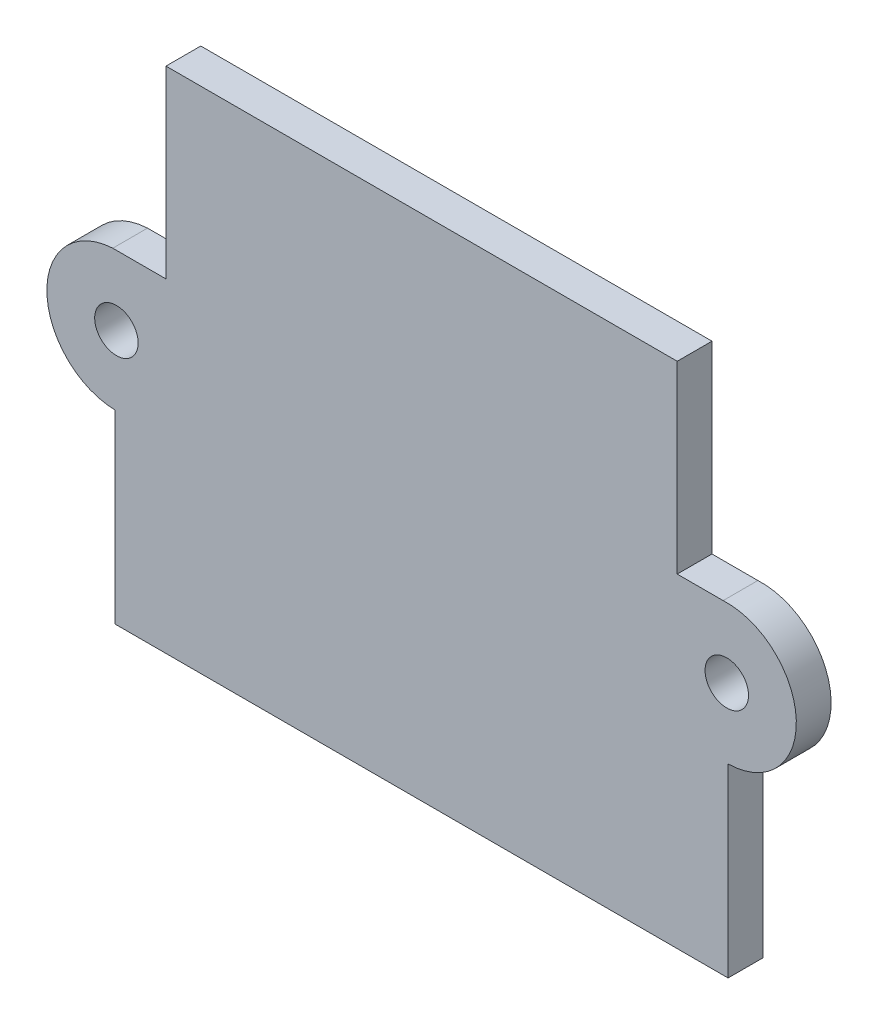
ISO-10303-21;
HEADER;
FILE_DESCRIPTION(('STEP AP214'),'2;1');
FILE_NAME('part.step','',(''),(''),'','','');
FILE_SCHEMA(('AUTOMOTIVE_DESIGN { 1 0 10303 214 1 1 1 1 }'));
ENDSEC;
DATA;
#1=APPLICATION_CONTEXT('core data for automotive mechanical design processes');
#2=APPLICATION_PROTOCOL_DEFINITION('international standard','automotive_design',2000,#1);
#3=PRODUCT_CONTEXT('',#1,'mechanical');
#4=PRODUCT('Part','Part','',(#3));
#5=PRODUCT_RELATED_PRODUCT_CATEGORY('part','',(#4));
#6=PRODUCT_DEFINITION_FORMATION('','',#4);
#7=PRODUCT_DEFINITION_CONTEXT('part definition',#1,'design');
#8=PRODUCT_DEFINITION('design','',#6,#7);
#9=PRODUCT_DEFINITION_SHAPE('','',#8);
#10=(LENGTH_UNIT() NAMED_UNIT(*) SI_UNIT(.MILLI.,.METRE.));
#11=(NAMED_UNIT(*) PLANE_ANGLE_UNIT() SI_UNIT($,.RADIAN.));
#12=(NAMED_UNIT(*) SI_UNIT($,.STERADIAN.) SOLID_ANGLE_UNIT());
#13=UNCERTAINTY_MEASURE_WITH_UNIT(LENGTH_MEASURE(1.E-05),#10,'distance_accuracy_value','');
#14=(GEOMETRIC_REPRESENTATION_CONTEXT(3) GLOBAL_UNCERTAINTY_ASSIGNED_CONTEXT((#13)) GLOBAL_UNIT_ASSIGNED_CONTEXT((#10,
#11,#12)) REPRESENTATION_CONTEXT('',''));
#15=CARTESIAN_POINT('',(0.,0.,0.));
#16=DIRECTION('',(0.,0.,1.));
#17=DIRECTION('',(1.,0.,0.));
#18=AXIS2_PLACEMENT_3D('',#15,#16,#17);
#19=CARTESIAN_POINT('',(8.9154,0.0165573963988308,1.016));
#20=DIRECTION('',(0.,0.,1.));
#21=DIRECTION('',(1.,0.,0.));
#22=AXIS2_PLACEMENT_3D('',#19,#20,#21);
#23=PLANE('',#22);
#24=CARTESIAN_POINT('',(-8.9154,0.0165573963988286,1.016));
#25=DIRECTION('',(0.,0.,1.));
#26=DIRECTION('',(1.,0.,0.));
#27=AXIS2_PLACEMENT_3D('',#24,#25,#26);
#28=CIRCLE('',#27,0.635000005703479);
#29=CARTESIAN_POINT('',(-8.28039999429652,0.0165573963988286,1.016));
#30=VERTEX_POINT('',#29);
#31=EDGE_CURVE('E214',#30,#30,#28,.T.);
#32=ORIENTED_EDGE('',*,*,#31,.F.);
#33=EDGE_LOOP('',(#32));
#34=FACE_BOUND('',#33,.T.);
#35=DIRECTION('',(1.,0.,0.));
#36=VECTOR('',#35,1.);
#37=CARTESIAN_POINT('',(-7.4676,7.43055011809355,1.016));
#38=LINE('',#37,#36);
#39=CARTESIAN_POINT('',(-7.4676,7.43055011809355,1.016));
#40=VERTEX_POINT('',#39);
#41=CARTESIAN_POINT('',(7.4676,7.43055011809355,1.016));
#42=VERTEX_POINT('',#41);
#43=EDGE_CURVE('E234',#40,#42,#38,.T.);
#44=ORIENTED_EDGE('',*,*,#43,.F.);
#45=DIRECTION('',(0.,-1.,0.));
#46=VECTOR('',#45,1.);
#47=CARTESIAN_POINT('',(-7.4676,7.43055011809355,1.016));
#48=LINE('',#47,#46);
#49=CARTESIAN_POINT('',(-7.4676,2.04575011809355,1.016));
#50=VERTEX_POINT('',#49);
#51=EDGE_CURVE('E188',#40,#50,#48,.T.);
#52=ORIENTED_EDGE('',*,*,#51,.T.);
#53=DIRECTION('',(-1.,0.,0.));
#54=VECTOR('',#53,1.);
#55=CARTESIAN_POINT('',(-7.4676,2.04575011809355,1.016));
#56=LINE('',#55,#54);
#57=CARTESIAN_POINT('',(-9.02217498874351,2.04575011809355,1.016));
#58=VERTEX_POINT('',#57);
#59=EDGE_CURVE('E181',#50,#58,#56,.T.);
#60=ORIENTED_EDGE('',*,*,#59,.T.);
#61=CARTESIAN_POINT('',(-8.9154,0.0165573963988286,1.016));
#62=DIRECTION('',(0.,0.,1.));
#63=DIRECTION('',(1.,0.,0.));
#64=AXIS2_PLACEMENT_3D('',#61,#62,#63);
#65=CIRCLE('',#64,2.032);
#66=CARTESIAN_POINT('',(-8.9535,-2.01508538470222,1.016));
#67=VERTEX_POINT('',#66);
#68=EDGE_CURVE('E186',#58,#67,#65,.T.);
#69=ORIENTED_EDGE('',*,*,#68,.T.);
#70=DIRECTION('',(0.,-1.,0.));
#71=VECTOR('',#70,1.);
#72=CARTESIAN_POINT('',(-8.9535,-2.01508538470222,1.016));
#73=LINE('',#72,#71);
#74=CARTESIAN_POINT('',(-8.9535,-7.43055011809355,1.016));
#75=VERTEX_POINT('',#74);
#76=EDGE_CURVE('E203',#67,#75,#73,.T.);
#77=ORIENTED_EDGE('',*,*,#76,.T.);
#78=DIRECTION('',(1.,0.,0.));
#79=VECTOR('',#78,1.);
#80=CARTESIAN_POINT('',(-8.9535,-7.43055011809355,1.016));
#81=LINE('',#80,#79);
#82=CARTESIAN_POINT('',(8.9535,-7.43055011809354,1.016));
#83=VERTEX_POINT('',#82);
#84=EDGE_CURVE('E205',#75,#83,#81,.T.);
#85=ORIENTED_EDGE('',*,*,#84,.T.);
#86=DIRECTION('',(0.,-1.,0.));
#87=VECTOR('',#86,1.);
#88=CARTESIAN_POINT('',(8.9535,-2.01508538470222,1.016));
#89=LINE('',#88,#87);
#90=CARTESIAN_POINT('',(8.9535,-2.01508538470222,1.016));
#91=VERTEX_POINT('',#90);
#92=EDGE_CURVE('E261',#91,#83,#89,.T.);
#93=ORIENTED_EDGE('',*,*,#92,.F.);
#94=CARTESIAN_POINT('',(8.9154,0.0165573963988308,1.016));
#95=DIRECTION('',(0.,0.,1.));
#96=DIRECTION('',(1.,0.,0.));
#97=AXIS2_PLACEMENT_3D('',#94,#95,#96);
#98=CIRCLE('',#97,2.032);
#99=CARTESIAN_POINT('',(8.80862501125642,2.04575011809355,1.016));
#100=VERTEX_POINT('',#99);
#101=EDGE_CURVE('E268',#91,#100,#98,.T.);
#102=ORIENTED_EDGE('',*,*,#101,.T.);
#103=DIRECTION('',(1.,0.,0.));
#104=VECTOR('',#103,1.);
#105=CARTESIAN_POINT('',(7.4676,2.04575011809355,1.016));
#106=LINE('',#105,#104);
#107=CARTESIAN_POINT('',(7.4676,2.04575011809355,1.016));
#108=VERTEX_POINT('',#107);
#109=EDGE_CURVE('E270',#108,#100,#106,.T.);
#110=ORIENTED_EDGE('',*,*,#109,.F.);
#111=DIRECTION('',(0.,-1.,0.));
#112=VECTOR('',#111,1.);
#113=CARTESIAN_POINT('',(7.4676,7.43055011809355,1.016));
#114=LINE('',#113,#112);
#115=EDGE_CURVE('E275',#42,#108,#114,.T.);
#116=ORIENTED_EDGE('',*,*,#115,.F.);
#117=EDGE_LOOP('',(#44,#52,#60,#69,#77,#85,#93,#102,#110,#116));
#118=FACE_BOUND('',#117,.T.);
#119=CARTESIAN_POINT('',(8.9154,0.0165573963988308,1.016));
#120=DIRECTION('',(0.,0.,1.));
#121=DIRECTION('',(1.,0.,0.));
#122=AXIS2_PLACEMENT_3D('',#119,#120,#121);
#123=CIRCLE('',#122,0.635000005703479);
#124=CARTESIAN_POINT('',(9.55040000570348,0.0165573963988308,1.016));
#125=VERTEX_POINT('',#124);
#126=EDGE_CURVE('E281',#125,#125,#123,.T.);
#127=ORIENTED_EDGE('',*,*,#126,.F.);
#128=EDGE_LOOP('',(#127));
#129=FACE_BOUND('',#128,.T.);
#130=ADVANCED_FACE('F99',(#34,#118,#129),#23,.T.);
#131=CARTESIAN_POINT('',(8.9154,0.0165573963988308,0.));
#132=DIRECTION('',(0.,0.,1.));
#133=DIRECTION('',(1.,0.,0.));
#134=AXIS2_PLACEMENT_3D('',#131,#132,#133);
#135=PLANE('',#134);
#136=CARTESIAN_POINT('',(-8.9154,0.0165573963988286,0.));
#137=DIRECTION('',(0.,0.,1.));
#138=DIRECTION('',(1.,0.,0.));
#139=AXIS2_PLACEMENT_3D('',#136,#137,#138);
#140=CIRCLE('',#139,0.635000005703479);
#141=CARTESIAN_POINT('',(-8.28039999429652,0.0165573963988286,0.));
#142=VERTEX_POINT('',#141);
#143=EDGE_CURVE('E278',#142,#142,#140,.T.);
#144=ORIENTED_EDGE('',*,*,#143,.T.);
#145=EDGE_LOOP('',(#144));
#146=FACE_BOUND('',#145,.T.);
#147=DIRECTION('',(1.,0.,0.));
#148=VECTOR('',#147,1.);
#149=CARTESIAN_POINT('',(-7.4676,7.43055011809355,0.));
#150=LINE('',#149,#148);
#151=CARTESIAN_POINT('',(-7.4676,7.43055011809355,0.));
#152=VERTEX_POINT('',#151);
#153=CARTESIAN_POINT('',(7.4676,7.43055011809355,0.));
#154=VERTEX_POINT('',#153);
#155=EDGE_CURVE('E210',#152,#154,#150,.T.);
#156=ORIENTED_EDGE('',*,*,#155,.T.);
#157=DIRECTION('',(0.,-1.,0.));
#158=VECTOR('',#157,1.);
#159=CARTESIAN_POINT('',(7.4676,7.43055011809355,0.));
#160=LINE('',#159,#158);
#161=CARTESIAN_POINT('',(7.4676,2.04575011809355,0.));
#162=VERTEX_POINT('',#161);
#163=EDGE_CURVE('E213',#154,#162,#160,.T.);
#164=ORIENTED_EDGE('',*,*,#163,.T.);
#165=DIRECTION('',(1.,0.,0.));
#166=VECTOR('',#165,1.);
#167=CARTESIAN_POINT('',(7.4676,2.04575011809355,0.));
#168=LINE('',#167,#166);
#169=CARTESIAN_POINT('',(8.80862501125642,2.04575011809355,0.));
#170=VERTEX_POINT('',#169);
#171=EDGE_CURVE('E217',#162,#170,#168,.T.);
#172=ORIENTED_EDGE('',*,*,#171,.T.);
#173=CARTESIAN_POINT('',(8.9154,0.0165573963988308,0.));
#174=DIRECTION('',(0.,0.,1.));
#175=DIRECTION('',(1.,0.,0.));
#176=AXIS2_PLACEMENT_3D('',#173,#174,#175);
#177=CIRCLE('',#176,2.032);
#178=CARTESIAN_POINT('',(8.9535,-2.01508538470222,0.));
#179=VERTEX_POINT('',#178);
#180=EDGE_CURVE('E220',#179,#170,#177,.T.);
#181=ORIENTED_EDGE('',*,*,#180,.F.);
#182=DIRECTION('',(0.,-1.,0.));
#183=VECTOR('',#182,1.);
#184=CARTESIAN_POINT('',(8.9535,-2.01508538470222,0.));
#185=LINE('',#184,#183);
#186=CARTESIAN_POINT('',(8.9535,-7.43055011809354,0.));
#187=VERTEX_POINT('',#186);
#188=EDGE_CURVE('E223',#179,#187,#185,.T.);
#189=ORIENTED_EDGE('',*,*,#188,.T.);
#190=DIRECTION('',(1.,0.,0.));
#191=VECTOR('',#190,1.);
#192=CARTESIAN_POINT('',(-8.9535,-7.43055011809355,0.));
#193=LINE('',#192,#191);
#194=CARTESIAN_POINT('',(-8.9535,-7.43055011809355,0.));
#195=VERTEX_POINT('',#194);
#196=EDGE_CURVE('E226',#195,#187,#193,.T.);
#197=ORIENTED_EDGE('',*,*,#196,.F.);
#198=DIRECTION('',(0.,-1.,0.));
#199=VECTOR('',#198,1.);
#200=CARTESIAN_POINT('',(-8.9535,-2.01508538470222,0.));
#201=LINE('',#200,#199);
#202=CARTESIAN_POINT('',(-8.9535,-2.01508538470222,0.));
#203=VERTEX_POINT('',#202);
#204=EDGE_CURVE('E229',#203,#195,#201,.T.);
#205=ORIENTED_EDGE('',*,*,#204,.F.);
#206=CARTESIAN_POINT('',(-8.9154,0.0165573963988286,0.));
#207=DIRECTION('',(0.,0.,1.));
#208=DIRECTION('',(1.,0.,0.));
#209=AXIS2_PLACEMENT_3D('',#206,#207,#208);
#210=CIRCLE('',#209,2.032);
#211=CARTESIAN_POINT('',(-9.02217498874351,2.04575011809355,0.));
#212=VERTEX_POINT('',#211);
#213=EDGE_CURVE('E231',#212,#203,#210,.T.);
#214=ORIENTED_EDGE('',*,*,#213,.F.);
#215=DIRECTION('',(-1.,0.,0.));
#216=VECTOR('',#215,1.);
#217=CARTESIAN_POINT('',(-7.4676,2.04575011809355,0.));
#218=LINE('',#217,#216);
#219=CARTESIAN_POINT('',(-7.4676,2.04575011809355,0.));
#220=VERTEX_POINT('',#219);
#221=EDGE_CURVE('E195',#220,#212,#218,.T.);
#222=ORIENTED_EDGE('',*,*,#221,.F.);
#223=DIRECTION('',(0.,-1.,0.));
#224=VECTOR('',#223,1.);
#225=CARTESIAN_POINT('',(-7.4676,7.43055011809355,0.));
#226=LINE('',#225,#224);
#227=EDGE_CURVE('E151',#152,#220,#226,.T.);
#228=ORIENTED_EDGE('',*,*,#227,.F.);
#229=EDGE_LOOP('',(#156,#164,#172,#181,#189,#197,#205,#214,#222,#228));
#230=FACE_BOUND('',#229,.T.);
#231=CARTESIAN_POINT('',(8.9154,0.0165573963988308,0.));
#232=DIRECTION('',(0.,0.,1.));
#233=DIRECTION('',(1.,0.,0.));
#234=AXIS2_PLACEMENT_3D('',#231,#232,#233);
#235=CIRCLE('',#234,0.635000005703479);
#236=CARTESIAN_POINT('',(9.55040000570348,0.0165573963988308,0.));
#237=VERTEX_POINT('',#236);
#238=EDGE_CURVE('E284',#237,#237,#235,.T.);
#239=ORIENTED_EDGE('',*,*,#238,.T.);
#240=EDGE_LOOP('',(#239));
#241=FACE_BOUND('',#240,.T.);
#242=ADVANCED_FACE('F250',(#146,#230,#241),#135,.F.);
#243=CARTESIAN_POINT('',(-7.4676,7.43055011809355,1.016));
#244=DIRECTION('',(0.,1.,0.));
#245=DIRECTION('',(0.,0.,1.));
#246=AXIS2_PLACEMENT_3D('',#243,#244,#245);
#247=PLANE('',#246);
#248=ORIENTED_EDGE('',*,*,#155,.F.);
#249=DIRECTION('',(0.,0.,-1.));
#250=VECTOR('',#249,1.);
#251=CARTESIAN_POINT('',(-7.4676,7.43055011809355,1.016));
#252=LINE('',#251,#250);
#253=EDGE_CURVE('E12',#40,#152,#252,.T.);
#254=ORIENTED_EDGE('',*,*,#253,.F.);
#255=ORIENTED_EDGE('',*,*,#43,.T.);
#256=DIRECTION('',(0.,0.,-1.));
#257=VECTOR('',#256,1.);
#258=CARTESIAN_POINT('',(7.4676,7.43055011809355,1.016));
#259=LINE('',#258,#257);
#260=EDGE_CURVE('E103',#42,#154,#259,.T.);
#261=ORIENTED_EDGE('',*,*,#260,.T.);
#262=EDGE_LOOP('',(#248,#254,#255,#261));
#263=FACE_BOUND('',#262,.T.);
#264=ADVANCED_FACE('F101',(#263),#247,.T.);
#265=CARTESIAN_POINT('',(-7.4676,7.43055011809355,1.016));
#266=DIRECTION('',(1.,0.,0.));
#267=DIRECTION('',(0.,1.,0.));
#268=AXIS2_PLACEMENT_3D('',#265,#266,#267);
#269=PLANE('',#268);
#270=ORIENTED_EDGE('',*,*,#227,.T.);
#271=DIRECTION('',(0.,0.,-1.));
#272=VECTOR('',#271,1.);
#273=CARTESIAN_POINT('',(-7.4676,2.04575011809355,1.016));
#274=LINE('',#273,#272);
#275=EDGE_CURVE('E109',#50,#220,#274,.T.);
#276=ORIENTED_EDGE('',*,*,#275,.F.);
#277=ORIENTED_EDGE('',*,*,#51,.F.);
#278=ORIENTED_EDGE('',*,*,#253,.T.);
#279=EDGE_LOOP('',(#270,#276,#277,#278));
#280=FACE_BOUND('',#279,.T.);
#281=ADVANCED_FACE('F305',(#280),#269,.F.);
#282=CARTESIAN_POINT('',(-7.4676,2.04575011809355,1.016));
#283=DIRECTION('',(0.,-1.,0.));
#284=DIRECTION('',(1.,0.,0.));
#285=AXIS2_PLACEMENT_3D('',#282,#283,#284);
#286=PLANE('',#285);
#287=ORIENTED_EDGE('',*,*,#221,.T.);
#288=DIRECTION('',(0.,0.,-1.));
#289=VECTOR('',#288,1.);
#290=CARTESIAN_POINT('',(-9.02217498874351,2.04575011809355,1.016));
#291=LINE('',#290,#289);
#292=EDGE_CURVE('E192',#58,#212,#291,.T.);
#293=ORIENTED_EDGE('',*,*,#292,.F.);
#294=ORIENTED_EDGE('',*,*,#59,.F.);
#295=ORIENTED_EDGE('',*,*,#275,.T.);
#296=EDGE_LOOP('',(#287,#293,#294,#295));
#297=FACE_BOUND('',#296,.T.);
#298=ADVANCED_FACE('F193',(#297),#286,.F.);
#299=CARTESIAN_POINT('',(-8.9154,0.0165573963988286,1.016));
#300=DIRECTION('',(0.,0.,-1.));
#301=DIRECTION('',(-1.,0.,0.));
#302=AXIS2_PLACEMENT_3D('',#299,#300,#301);
#303=CYLINDRICAL_SURFACE('',#302,2.032);
#304=ORIENTED_EDGE('',*,*,#213,.T.);
#305=DIRECTION('',(0.,0.,-1.));
#306=VECTOR('',#305,1.);
#307=CARTESIAN_POINT('',(-8.9535,-2.01508538470222,1.016));
#308=LINE('',#307,#306);
#309=EDGE_CURVE('E198',#67,#203,#308,.T.);
#310=ORIENTED_EDGE('',*,*,#309,.F.);
#311=ORIENTED_EDGE('',*,*,#68,.F.);
#312=ORIENTED_EDGE('',*,*,#292,.T.);
#313=EDGE_LOOP('',(#304,#310,#311,#312));
#314=FACE_BOUND('',#313,.T.);
#315=ADVANCED_FACE('F200',(#314),#303,.T.);
#316=CARTESIAN_POINT('',(-8.9535,-2.01508538470222,1.016));
#317=DIRECTION('',(1.,0.,0.));
#318=DIRECTION('',(0.,0.,-1.));
#319=AXIS2_PLACEMENT_3D('',#316,#317,#318);
#320=PLANE('',#319);
#321=ORIENTED_EDGE('',*,*,#204,.T.);
#322=DIRECTION('',(0.,0.,-1.));
#323=VECTOR('',#322,1.);
#324=CARTESIAN_POINT('',(-8.9535,-7.43055011809355,1.016));
#325=LINE('',#324,#323);
#326=EDGE_CURVE('E238',#75,#195,#325,.T.);
#327=ORIENTED_EDGE('',*,*,#326,.F.);
#328=ORIENTED_EDGE('',*,*,#76,.F.);
#329=ORIENTED_EDGE('',*,*,#309,.T.);
#330=EDGE_LOOP('',(#321,#327,#328,#329));
#331=FACE_BOUND('',#330,.T.);
#332=ADVANCED_FACE('F255',(#331),#320,.F.);
#333=CARTESIAN_POINT('',(-8.9535,-7.43055011809355,1.016));
#334=DIRECTION('',(0.,1.,0.));
#335=DIRECTION('',(-1.,0.,0.));
#336=AXIS2_PLACEMENT_3D('',#333,#334,#335);
#337=PLANE('',#336);
#338=ORIENTED_EDGE('',*,*,#196,.T.);
#339=DIRECTION('',(0.,0.,-1.));
#340=VECTOR('',#339,1.);
#341=CARTESIAN_POINT('',(8.9535,-7.43055011809354,1.016));
#342=LINE('',#341,#340);
#343=EDGE_CURVE('E241',#83,#187,#342,.T.);
#344=ORIENTED_EDGE('',*,*,#343,.F.);
#345=ORIENTED_EDGE('',*,*,#84,.F.);
#346=ORIENTED_EDGE('',*,*,#326,.T.);
#347=EDGE_LOOP('',(#338,#344,#345,#346));
#348=FACE_BOUND('',#347,.T.);
#349=ADVANCED_FACE('F263',(#348),#337,.F.);
#350=CARTESIAN_POINT('',(8.9535,-2.01508538470222,1.016));
#351=DIRECTION('',(1.,0.,0.));
#352=DIRECTION('',(0.,1.,0.));
#353=AXIS2_PLACEMENT_3D('',#350,#351,#352);
#354=PLANE('',#353);
#355=ORIENTED_EDGE('',*,*,#188,.F.);
#356=DIRECTION('',(0.,0.,-1.));
#357=VECTOR('',#356,1.);
#358=CARTESIAN_POINT('',(8.9535,-2.01508538470222,1.016));
#359=LINE('',#358,#357);
#360=EDGE_CURVE('E243',#91,#179,#359,.T.);
#361=ORIENTED_EDGE('',*,*,#360,.F.);
#362=ORIENTED_EDGE('',*,*,#92,.T.);
#363=ORIENTED_EDGE('',*,*,#343,.T.);
#364=EDGE_LOOP('',(#355,#361,#362,#363));
#365=FACE_BOUND('',#364,.T.);
#366=ADVANCED_FACE('F266',(#365),#354,.T.);
#367=CARTESIAN_POINT('',(8.9154,0.0165573963988308,1.016));
#368=DIRECTION('',(0.,0.,-1.));
#369=DIRECTION('',(-1.,0.,0.));
#370=AXIS2_PLACEMENT_3D('',#367,#368,#369);
#371=CYLINDRICAL_SURFACE('',#370,2.032);
#372=ORIENTED_EDGE('',*,*,#180,.T.);
#373=DIRECTION('',(0.,0.,-1.));
#374=VECTOR('',#373,1.);
#375=CARTESIAN_POINT('',(8.80862501125642,2.04575011809355,1.016));
#376=LINE('',#375,#374);
#377=EDGE_CURVE('E245',#100,#170,#376,.T.);
#378=ORIENTED_EDGE('',*,*,#377,.F.);
#379=ORIENTED_EDGE('',*,*,#101,.F.);
#380=ORIENTED_EDGE('',*,*,#360,.T.);
#381=EDGE_LOOP('',(#372,#378,#379,#380));
#382=FACE_BOUND('',#381,.T.);
#383=ADVANCED_FACE('F318',(#382),#371,.T.);
#384=CARTESIAN_POINT('',(7.4676,2.04575011809355,1.016));
#385=DIRECTION('',(0.,1.,0.));
#386=DIRECTION('',(-1.,0.,0.));
#387=AXIS2_PLACEMENT_3D('',#384,#385,#386);
#388=PLANE('',#387);
#389=ORIENTED_EDGE('',*,*,#171,.F.);
#390=DIRECTION('',(0.,0.,-1.));
#391=VECTOR('',#390,1.);
#392=CARTESIAN_POINT('',(7.4676,2.04575011809355,1.016));
#393=LINE('',#392,#391);
#394=EDGE_CURVE('E246',#108,#162,#393,.T.);
#395=ORIENTED_EDGE('',*,*,#394,.F.);
#396=ORIENTED_EDGE('',*,*,#109,.T.);
#397=ORIENTED_EDGE('',*,*,#377,.T.);
#398=EDGE_LOOP('',(#389,#395,#396,#397));
#399=FACE_BOUND('',#398,.T.);
#400=ADVANCED_FACE('F321',(#399),#388,.T.);
#401=CARTESIAN_POINT('',(7.4676,7.43055011809355,1.016));
#402=DIRECTION('',(1.,0.,0.));
#403=DIRECTION('',(0.,1.,0.));
#404=AXIS2_PLACEMENT_3D('',#401,#402,#403);
#405=PLANE('',#404);
#406=ORIENTED_EDGE('',*,*,#163,.F.);
#407=ORIENTED_EDGE('',*,*,#260,.F.);
#408=ORIENTED_EDGE('',*,*,#115,.T.);
#409=ORIENTED_EDGE('',*,*,#394,.T.);
#410=EDGE_LOOP('',(#406,#407,#408,#409));
#411=FACE_BOUND('',#410,.T.);
#412=ADVANCED_FACE('F248',(#411),#405,.T.);
#413=CARTESIAN_POINT('',(-8.9154,0.0165573963988286,1.016));
#414=DIRECTION('',(0.,0.,-1.));
#415=DIRECTION('',(-1.,0.,0.));
#416=AXIS2_PLACEMENT_3D('',#413,#414,#415);
#417=CYLINDRICAL_SURFACE('',#416,0.635000005703479);
#418=ORIENTED_EDGE('',*,*,#31,.T.);
#419=EDGE_LOOP('',(#418));
#420=FACE_BOUND('',#419,.T.);
#421=ORIENTED_EDGE('',*,*,#143,.F.);
#422=EDGE_LOOP('',(#421));
#423=FACE_BOUND('',#422,.T.);
#424=ADVANCED_FACE('F302',(#420,#423),#417,.F.);
#425=CARTESIAN_POINT('',(8.9154,0.0165573963988308,1.016));
#426=DIRECTION('',(0.,0.,-1.));
#427=DIRECTION('',(-1.,0.,0.));
#428=AXIS2_PLACEMENT_3D('',#425,#426,#427);
#429=CYLINDRICAL_SURFACE('',#428,0.635000005703479);
#430=ORIENTED_EDGE('',*,*,#126,.T.);
#431=EDGE_LOOP('',(#430));
#432=FACE_BOUND('',#431,.T.);
#433=ORIENTED_EDGE('',*,*,#238,.F.);
#434=EDGE_LOOP('',(#433));
#435=FACE_BOUND('',#434,.T.);
#436=ADVANCED_FACE('F290',(#432,#435),#429,.F.);
#437=CLOSED_SHELL('',(#130,#242,#264,#281,#298,#315,#332,#349,#366,#383,#400,#412,#424,#436));
#438=MANIFOLD_SOLID_BREP('B2',#437);
#439=ADVANCED_BREP_SHAPE_REPRESENTATION('',(#18,#438),#14);
#440=SHAPE_DEFINITION_REPRESENTATION(#9,#439);
ENDSEC;
END-ISO-10303-21;
